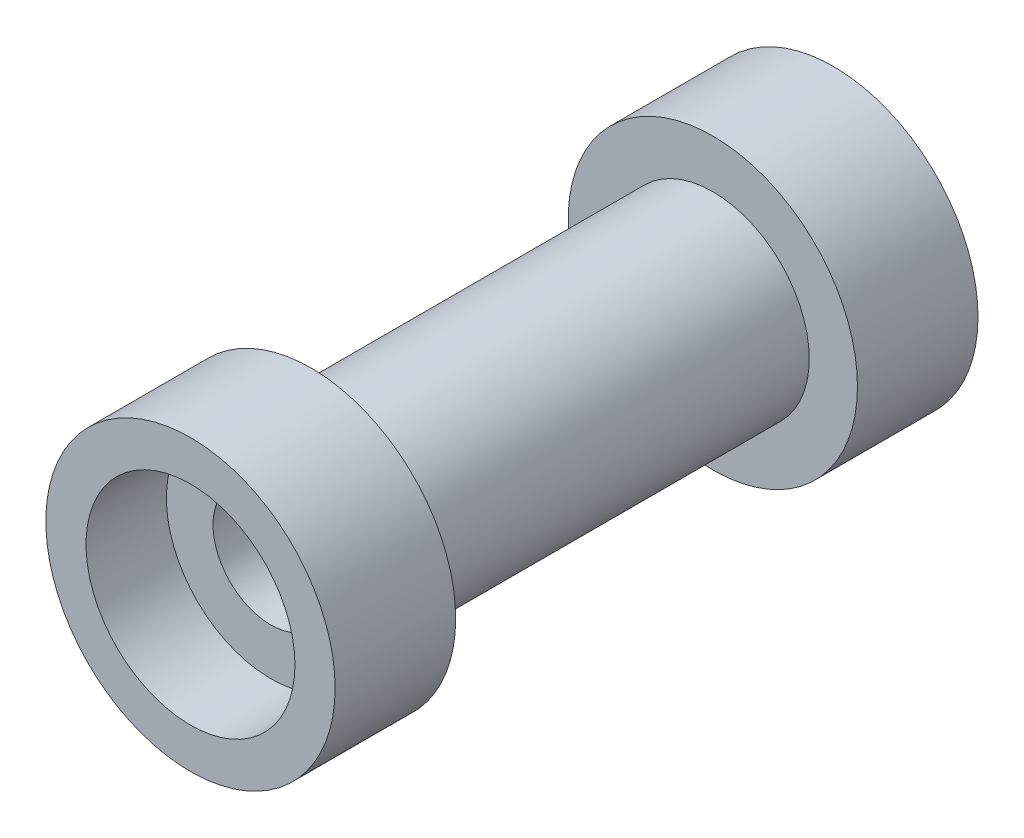
ISO-10303-21;
HEADER;
FILE_DESCRIPTION(('STEP AP214'),'2;1');
FILE_NAME('part.step','',(''),(''),'','','');
FILE_SCHEMA(('AUTOMOTIVE_DESIGN { 1 0 10303 214 1 1 1 1 }'));
ENDSEC;
DATA;
#1=APPLICATION_CONTEXT('core data for automotive mechanical design processes');
#2=APPLICATION_PROTOCOL_DEFINITION('international standard','automotive_design',2000,#1);
#3=PRODUCT_CONTEXT('',#1,'mechanical');
#4=PRODUCT('Part','Part','',(#3));
#5=PRODUCT_RELATED_PRODUCT_CATEGORY('part','',(#4));
#6=PRODUCT_DEFINITION_FORMATION('','',#4);
#7=PRODUCT_DEFINITION_CONTEXT('part definition',#1,'design');
#8=PRODUCT_DEFINITION('design','',#6,#7);
#9=PRODUCT_DEFINITION_SHAPE('','',#8);
#10=(LENGTH_UNIT() NAMED_UNIT(*) SI_UNIT(.MILLI.,.METRE.));
#11=(NAMED_UNIT(*) PLANE_ANGLE_UNIT() SI_UNIT($,.RADIAN.));
#12=(NAMED_UNIT(*) SI_UNIT($,.STERADIAN.) SOLID_ANGLE_UNIT());
#13=UNCERTAINTY_MEASURE_WITH_UNIT(LENGTH_MEASURE(1.E-05),#10,'distance_accuracy_value','');
#14=(GEOMETRIC_REPRESENTATION_CONTEXT(3) GLOBAL_UNCERTAINTY_ASSIGNED_CONTEXT((#13)) GLOBAL_UNIT_ASSIGNED_CONTEXT((#10,
#11,#12)) REPRESENTATION_CONTEXT('',''));
#15=CARTESIAN_POINT('',(0.,0.,0.));
#16=DIRECTION('',(0.,0.,1.));
#17=DIRECTION('',(1.,0.,0.));
#18=AXIS2_PLACEMENT_3D('',#15,#16,#17);
#19=CARTESIAN_POINT('',(-6.,0.,-12.5));
#20=DIRECTION('',(0.,0.,-1.));
#21=DIRECTION('',(-1.,0.,0.));
#22=AXIS2_PLACEMENT_3D('',#19,#20,#21);
#23=PLANE('',#22);
#24=CARTESIAN_POINT('',(0.,0.,-12.5));
#25=DIRECTION('',(0.,0.,1.));
#26=DIRECTION('',(1.,0.,0.));
#27=AXIS2_PLACEMENT_3D('',#24,#25,#26);
#28=CIRCLE('',#27,6.);
#29=CARTESIAN_POINT('',(6.,0.,-12.5));
#30=VERTEX_POINT('',#29);
#31=EDGE_CURVE('E77',#30,#30,#28,.T.);
#32=ORIENTED_EDGE('',*,*,#31,.F.);
#33=EDGE_LOOP('',(#32));
#34=FACE_BOUND('',#33,.T.);
#35=CARTESIAN_POINT('',(0.,0.,-12.5));
#36=DIRECTION('',(0.,0.,1.));
#37=DIRECTION('',(1.,0.,0.));
#38=AXIS2_PLACEMENT_3D('',#35,#36,#37);
#39=CIRCLE('',#38,9.);
#40=CARTESIAN_POINT('',(9.,0.,-12.5));
#41=VERTEX_POINT('',#40);
#42=EDGE_CURVE('E10',#41,#41,#39,.T.);
#43=ORIENTED_EDGE('',*,*,#42,.T.);
#44=EDGE_LOOP('',(#43));
#45=FACE_BOUND('',#44,.T.);
#46=ADVANCED_FACE('F37',(#34,#45),#23,.F.);
#47=CARTESIAN_POINT('',(0.,0.,0.));
#48=DIRECTION('',(0.,0.,1.));
#49=DIRECTION('',(1.,0.,0.));
#50=AXIS2_PLACEMENT_3D('',#47,#48,#49);
#51=CYLINDRICAL_SURFACE('',#50,9.);
#52=ORIENTED_EDGE('',*,*,#42,.F.);
#53=EDGE_LOOP('',(#52));
#54=FACE_BOUND('',#53,.T.);
#55=CARTESIAN_POINT('',(0.,0.,-20.));
#56=DIRECTION('',(0.,0.,1.));
#57=DIRECTION('',(1.,0.,0.));
#58=AXIS2_PLACEMENT_3D('',#55,#56,#57);
#59=CIRCLE('',#58,9.);
#60=CARTESIAN_POINT('',(9.,0.,-20.));
#61=VERTEX_POINT('',#60);
#62=EDGE_CURVE('E43',#61,#61,#59,.T.);
#63=ORIENTED_EDGE('',*,*,#62,.T.);
#64=EDGE_LOOP('',(#63));
#65=FACE_BOUND('',#64,.T.);
#66=ADVANCED_FACE('F84',(#54,#65),#51,.T.);
#67=CARTESIAN_POINT('',(-9.,0.,-20.));
#68=DIRECTION('',(0.,0.,1.));
#69=DIRECTION('',(1.,0.,0.));
#70=AXIS2_PLACEMENT_3D('',#67,#68,#69);
#71=PLANE('',#70);
#72=ORIENTED_EDGE('',*,*,#62,.F.);
#73=EDGE_LOOP('',(#72));
#74=FACE_BOUND('',#73,.T.);
#75=CARTESIAN_POINT('',(0.,0.,-20.));
#76=DIRECTION('',(0.,0.,1.));
#77=DIRECTION('',(1.,0.,0.));
#78=AXIS2_PLACEMENT_3D('',#75,#76,#77);
#79=CIRCLE('',#78,6.5);
#80=CARTESIAN_POINT('',(6.5,0.,-20.));
#81=VERTEX_POINT('',#80);
#82=EDGE_CURVE('E47',#81,#81,#79,.T.);
#83=ORIENTED_EDGE('',*,*,#82,.T.);
#84=EDGE_LOOP('',(#83));
#85=FACE_BOUND('',#84,.T.);
#86=ADVANCED_FACE('F88',(#74,#85),#71,.F.);
#87=CARTESIAN_POINT('',(0.,0.,0.));
#88=DIRECTION('',(0.,0.,1.));
#89=DIRECTION('',(1.,0.,0.));
#90=AXIS2_PLACEMENT_3D('',#87,#88,#89);
#91=CYLINDRICAL_SURFACE('',#90,6.5);
#92=ORIENTED_EDGE('',*,*,#82,.F.);
#93=EDGE_LOOP('',(#92));
#94=FACE_BOUND('',#93,.T.);
#95=CARTESIAN_POINT('',(0.,0.,-15.));
#96=DIRECTION('',(0.,0.,1.));
#97=DIRECTION('',(1.,0.,0.));
#98=AXIS2_PLACEMENT_3D('',#95,#96,#97);
#99=CIRCLE('',#98,6.5);
#100=CARTESIAN_POINT('',(6.5,0.,-15.));
#101=VERTEX_POINT('',#100);
#102=EDGE_CURVE('E51',#101,#101,#99,.T.);
#103=ORIENTED_EDGE('',*,*,#102,.T.);
#104=EDGE_LOOP('',(#103));
#105=FACE_BOUND('',#104,.T.);
#106=ADVANCED_FACE('F93',(#94,#105),#91,.F.);
#107=CARTESIAN_POINT('',(-6.5,0.,-15.));
#108=DIRECTION('',(0.,0.,1.));
#109=DIRECTION('',(1.,0.,0.));
#110=AXIS2_PLACEMENT_3D('',#107,#108,#109);
#111=PLANE('',#110);
#112=ORIENTED_EDGE('',*,*,#102,.F.);
#113=EDGE_LOOP('',(#112));
#114=FACE_BOUND('',#113,.T.);
#115=CARTESIAN_POINT('',(0.,0.,-15.));
#116=DIRECTION('',(0.,0.,1.));
#117=DIRECTION('',(1.,0.,0.));
#118=AXIS2_PLACEMENT_3D('',#115,#116,#117);
#119=CIRCLE('',#118,3.6);
#120=CARTESIAN_POINT('',(3.6,0.,-15.));
#121=VERTEX_POINT('',#120);
#122=EDGE_CURVE('E56',#121,#121,#119,.T.);
#123=ORIENTED_EDGE('',*,*,#122,.T.);
#124=EDGE_LOOP('',(#123));
#125=FACE_BOUND('',#124,.T.);
#126=ADVANCED_FACE('F99',(#114,#125),#111,.F.);
#127=CARTESIAN_POINT('',(0.,0.,0.));
#128=DIRECTION('',(0.,0.,1.));
#129=DIRECTION('',(1.,0.,0.));
#130=AXIS2_PLACEMENT_3D('',#127,#128,#129);
#131=CYLINDRICAL_SURFACE('',#130,3.6);
#132=ORIENTED_EDGE('',*,*,#122,.F.);
#133=EDGE_LOOP('',(#132));
#134=FACE_BOUND('',#133,.T.);
#135=CARTESIAN_POINT('',(0.,0.,15.));
#136=DIRECTION('',(0.,0.,1.));
#137=DIRECTION('',(1.,0.,0.));
#138=AXIS2_PLACEMENT_3D('',#135,#136,#137);
#139=CIRCLE('',#138,3.6);
#140=CARTESIAN_POINT('',(3.6,0.,15.));
#141=VERTEX_POINT('',#140);
#142=EDGE_CURVE('E59',#141,#141,#139,.T.);
#143=ORIENTED_EDGE('',*,*,#142,.T.);
#144=EDGE_LOOP('',(#143));
#145=FACE_BOUND('',#144,.T.);
#146=ADVANCED_FACE('F103',(#134,#145),#131,.F.);
#147=CARTESIAN_POINT('',(-6.5,0.,15.));
#148=DIRECTION('',(0.,0.,-1.));
#149=DIRECTION('',(-1.,0.,0.));
#150=AXIS2_PLACEMENT_3D('',#147,#148,#149);
#151=PLANE('',#150);
#152=ORIENTED_EDGE('',*,*,#142,.F.);
#153=EDGE_LOOP('',(#152));
#154=FACE_BOUND('',#153,.T.);
#155=CARTESIAN_POINT('',(0.,0.,15.));
#156=DIRECTION('',(0.,0.,1.));
#157=DIRECTION('',(1.,0.,0.));
#158=AXIS2_PLACEMENT_3D('',#155,#156,#157);
#159=CIRCLE('',#158,6.5);
#160=CARTESIAN_POINT('',(6.5,0.,15.));
#161=VERTEX_POINT('',#160);
#162=EDGE_CURVE('E62',#161,#161,#159,.T.);
#163=ORIENTED_EDGE('',*,*,#162,.T.);
#164=EDGE_LOOP('',(#163));
#165=FACE_BOUND('',#164,.T.);
#166=ADVANCED_FACE('F107',(#154,#165),#151,.F.);
#167=CARTESIAN_POINT('',(0.,0.,0.));
#168=DIRECTION('',(0.,0.,1.));
#169=DIRECTION('',(1.,0.,0.));
#170=AXIS2_PLACEMENT_3D('',#167,#168,#169);
#171=CYLINDRICAL_SURFACE('',#170,6.5);
#172=ORIENTED_EDGE('',*,*,#162,.F.);
#173=EDGE_LOOP('',(#172));
#174=FACE_BOUND('',#173,.T.);
#175=CARTESIAN_POINT('',(0.,0.,20.));
#176=DIRECTION('',(0.,0.,1.));
#177=DIRECTION('',(1.,0.,0.));
#178=AXIS2_PLACEMENT_3D('',#175,#176,#177);
#179=CIRCLE('',#178,6.5);
#180=CARTESIAN_POINT('',(6.5,0.,20.));
#181=VERTEX_POINT('',#180);
#182=EDGE_CURVE('E65',#181,#181,#179,.T.);
#183=ORIENTED_EDGE('',*,*,#182,.T.);
#184=EDGE_LOOP('',(#183));
#185=FACE_BOUND('',#184,.T.);
#186=ADVANCED_FACE('F111',(#174,#185),#171,.F.);
#187=CARTESIAN_POINT('',(-9.,0.,20.));
#188=DIRECTION('',(0.,0.,-1.));
#189=DIRECTION('',(-1.,0.,0.));
#190=AXIS2_PLACEMENT_3D('',#187,#188,#189);
#191=PLANE('',#190);
#192=ORIENTED_EDGE('',*,*,#182,.F.);
#193=EDGE_LOOP('',(#192));
#194=FACE_BOUND('',#193,.T.);
#195=CARTESIAN_POINT('',(0.,0.,20.));
#196=DIRECTION('',(0.,0.,1.));
#197=DIRECTION('',(1.,0.,0.));
#198=AXIS2_PLACEMENT_3D('',#195,#196,#197);
#199=CIRCLE('',#198,9.);
#200=CARTESIAN_POINT('',(9.,0.,20.));
#201=VERTEX_POINT('',#200);
#202=EDGE_CURVE('E68',#201,#201,#199,.T.);
#203=ORIENTED_EDGE('',*,*,#202,.T.);
#204=EDGE_LOOP('',(#203));
#205=FACE_BOUND('',#204,.T.);
#206=ADVANCED_FACE('F115',(#194,#205),#191,.F.);
#207=CARTESIAN_POINT('',(0.,0.,0.));
#208=DIRECTION('',(0.,0.,1.));
#209=DIRECTION('',(1.,0.,0.));
#210=AXIS2_PLACEMENT_3D('',#207,#208,#209);
#211=CYLINDRICAL_SURFACE('',#210,9.);
#212=ORIENTED_EDGE('',*,*,#202,.F.);
#213=EDGE_LOOP('',(#212));
#214=FACE_BOUND('',#213,.T.);
#215=CARTESIAN_POINT('',(0.,0.,12.5));
#216=DIRECTION('',(0.,0.,1.));
#217=DIRECTION('',(1.,0.,0.));
#218=AXIS2_PLACEMENT_3D('',#215,#216,#217);
#219=CIRCLE('',#218,9.);
#220=CARTESIAN_POINT('',(9.,0.,12.5));
#221=VERTEX_POINT('',#220);
#222=EDGE_CURVE('E71',#221,#221,#219,.T.);
#223=ORIENTED_EDGE('',*,*,#222,.T.);
#224=EDGE_LOOP('',(#223));
#225=FACE_BOUND('',#224,.T.);
#226=ADVANCED_FACE('F119',(#214,#225),#211,.T.);
#227=CARTESIAN_POINT('',(-6.,0.,12.5));
#228=DIRECTION('',(0.,0.,1.));
#229=DIRECTION('',(1.,0.,0.));
#230=AXIS2_PLACEMENT_3D('',#227,#228,#229);
#231=PLANE('',#230);
#232=ORIENTED_EDGE('',*,*,#222,.F.);
#233=EDGE_LOOP('',(#232));
#234=FACE_BOUND('',#233,.T.);
#235=CARTESIAN_POINT('',(0.,0.,12.5));
#236=DIRECTION('',(0.,0.,1.));
#237=DIRECTION('',(1.,0.,0.));
#238=AXIS2_PLACEMENT_3D('',#235,#236,#237);
#239=CIRCLE('',#238,6.);
#240=CARTESIAN_POINT('',(6.,0.,12.5));
#241=VERTEX_POINT('',#240);
#242=EDGE_CURVE('E74',#241,#241,#239,.T.);
#243=ORIENTED_EDGE('',*,*,#242,.T.);
#244=EDGE_LOOP('',(#243));
#245=FACE_BOUND('',#244,.T.);
#246=ADVANCED_FACE('F123',(#234,#245),#231,.F.);
#247=CARTESIAN_POINT('',(0.,0.,0.));
#248=DIRECTION('',(0.,0.,1.));
#249=DIRECTION('',(1.,0.,0.));
#250=AXIS2_PLACEMENT_3D('',#247,#248,#249);
#251=CYLINDRICAL_SURFACE('',#250,6.);
#252=ORIENTED_EDGE('',*,*,#242,.F.);
#253=EDGE_LOOP('',(#252));
#254=FACE_BOUND('',#253,.T.);
#255=ORIENTED_EDGE('',*,*,#31,.T.);
#256=EDGE_LOOP('',(#255));
#257=FACE_BOUND('',#256,.T.);
#258=ADVANCED_FACE('F81',(#254,#257),#251,.T.);
#259=CLOSED_SHELL('',(#46,#66,#86,#106,#126,#146,#166,#186,#206,#226,#246,#258));
#260=MANIFOLD_SOLID_BREP('B2',#259);
#261=ADVANCED_BREP_SHAPE_REPRESENTATION('',(#18,#260),#14);
#262=SHAPE_DEFINITION_REPRESENTATION(#9,#261);
ENDSEC;
END-ISO-10303-21;
